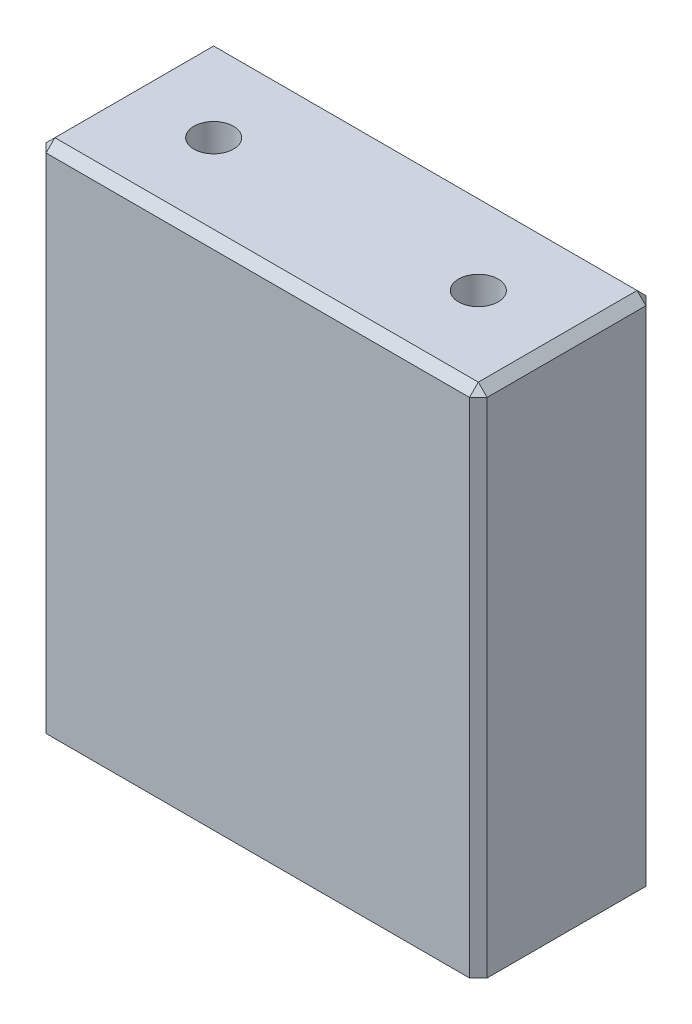
ISO-10303-21;
HEADER;
FILE_DESCRIPTION(('STEP AP214'),'2;1');
FILE_NAME('part.step','',(''),(''),'','','');
FILE_SCHEMA(('AUTOMOTIVE_DESIGN { 1 0 10303 214 1 1 1 1 }'));
ENDSEC;
DATA;
#1=APPLICATION_CONTEXT('core data for automotive mechanical design processes');
#2=APPLICATION_PROTOCOL_DEFINITION('international standard','automotive_design',2000,#1);
#3=PRODUCT_CONTEXT('',#1,'mechanical');
#4=PRODUCT('Part','Part','',(#3));
#5=PRODUCT_RELATED_PRODUCT_CATEGORY('part','',(#4));
#6=PRODUCT_DEFINITION_FORMATION('','',#4);
#7=PRODUCT_DEFINITION_CONTEXT('part definition',#1,'design');
#8=PRODUCT_DEFINITION('design','',#6,#7);
#9=PRODUCT_DEFINITION_SHAPE('','',#8);
#10=(LENGTH_UNIT() NAMED_UNIT(*) SI_UNIT(.MILLI.,.METRE.));
#11=(NAMED_UNIT(*) PLANE_ANGLE_UNIT() SI_UNIT($,.RADIAN.));
#12=(NAMED_UNIT(*) SI_UNIT($,.STERADIAN.) SOLID_ANGLE_UNIT());
#13=UNCERTAINTY_MEASURE_WITH_UNIT(LENGTH_MEASURE(1.E-05),#10,'distance_accuracy_value','');
#14=(GEOMETRIC_REPRESENTATION_CONTEXT(3) GLOBAL_UNCERTAINTY_ASSIGNED_CONTEXT((#13)) GLOBAL_UNIT_ASSIGNED_CONTEXT((#10,
#11,#12)) REPRESENTATION_CONTEXT('',''));
#15=CARTESIAN_POINT('',(0.,0.,0.));
#16=DIRECTION('',(0.,0.,1.));
#17=DIRECTION('',(1.,0.,0.));
#18=AXIS2_PLACEMENT_3D('',#15,#16,#17);
#19=CARTESIAN_POINT('',(50.,0.,10.));
#20=DIRECTION('',(0.,1.,0.));
#21=DIRECTION('',(-1.,0.,0.));
#22=AXIS2_PLACEMENT_3D('',#19,#20,#21);
#23=CYLINDRICAL_SURFACE('',#22,2.25);
#24=CARTESIAN_POINT('',(50.,58.,10.));
#25=DIRECTION('',(0.,1.,0.));
#26=DIRECTION('',(-1.,0.,0.));
#27=AXIS2_PLACEMENT_3D('',#24,#25,#26);
#28=CIRCLE('',#27,2.25);
#29=CARTESIAN_POINT('',(47.75,58.,10.));
#30=VERTEX_POINT('',#29);
#31=EDGE_CURVE('E201',#30,#30,#28,.T.);
#32=ORIENTED_EDGE('',*,*,#31,.T.);
#33=EDGE_LOOP('',(#32));
#34=FACE_BOUND('',#33,.T.);
#35=CARTESIAN_POINT('',(50.,53.,10.));
#36=DIRECTION('',(0.,-1.,0.));
#37=DIRECTION('',(1.,0.,0.));
#38=AXIS2_PLACEMENT_3D('',#35,#36,#37);
#39=CIRCLE('',#38,2.25);
#40=CARTESIAN_POINT('',(52.25,53.,10.));
#41=VERTEX_POINT('',#40);
#42=EDGE_CURVE('E198',#41,#41,#39,.F.);
#43=ORIENTED_EDGE('',*,*,#42,.F.);
#44=EDGE_LOOP('',(#43));
#45=FACE_BOUND('',#44,.T.);
#46=ADVANCED_FACE('F47',(#34,#45),#23,.F.);
#47=CARTESIAN_POINT('',(20.,0.,10.));
#48=DIRECTION('',(0.,1.,0.));
#49=DIRECTION('',(-1.,0.,0.));
#50=AXIS2_PLACEMENT_3D('',#47,#48,#49);
#51=CYLINDRICAL_SURFACE('',#50,2.25);
#52=CARTESIAN_POINT('',(20.,58.,10.));
#53=DIRECTION('',(0.,1.,0.));
#54=DIRECTION('',(-1.,0.,0.));
#55=AXIS2_PLACEMENT_3D('',#52,#53,#54);
#56=CIRCLE('',#55,2.25);
#57=CARTESIAN_POINT('',(17.75,58.,10.));
#58=VERTEX_POINT('',#57);
#59=EDGE_CURVE('E202',#58,#58,#56,.T.);
#60=ORIENTED_EDGE('',*,*,#59,.T.);
#61=EDGE_LOOP('',(#60));
#62=FACE_BOUND('',#61,.T.);
#63=CARTESIAN_POINT('',(20.,53.,10.));
#64=DIRECTION('',(0.,-1.,0.));
#65=DIRECTION('',(1.,0.,0.));
#66=AXIS2_PLACEMENT_3D('',#63,#64,#65);
#67=CIRCLE('',#66,2.25);
#68=CARTESIAN_POINT('',(22.25,53.,10.));
#69=VERTEX_POINT('',#68);
#70=EDGE_CURVE('E196',#69,#69,#67,.F.);
#71=ORIENTED_EDGE('',*,*,#70,.F.);
#72=EDGE_LOOP('',(#71));
#73=FACE_BOUND('',#72,.T.);
#74=ADVANCED_FACE('F361',(#62,#73),#51,.F.);
#75=CARTESIAN_POINT('',(60.,58.,20.));
#76=DIRECTION('',(0.,-1.,0.));
#77=DIRECTION('',(1.,0.,0.));
#78=AXIS2_PLACEMENT_3D('',#75,#76,#77);
#79=PLANE('',#78);
#80=DIRECTION('',(-1.,0.,0.));
#81=VECTOR('',#80,1.);
#82=CARTESIAN_POINT('',(60.,58.,1.00000000000001));
#83=LINE('',#82,#81);
#84=CARTESIAN_POINT('',(59.,58.,1.00000000000001));
#85=VERTEX_POINT('',#84);
#86=CARTESIAN_POINT('',(11.,58.,1.00000000000001));
#87=VERTEX_POINT('',#86);
#88=EDGE_CURVE('E58',#85,#87,#83,.T.);
#89=ORIENTED_EDGE('',*,*,#88,.T.);
#90=DIRECTION('',(0.,0.,1.));
#91=VECTOR('',#90,1.);
#92=CARTESIAN_POINT('',(11.,58.,20.));
#93=LINE('',#92,#91);
#94=CARTESIAN_POINT('',(11.,58.,19.));
#95=VERTEX_POINT('',#94);
#96=EDGE_CURVE('E12',#87,#95,#93,.T.);
#97=ORIENTED_EDGE('',*,*,#96,.T.);
#98=DIRECTION('',(1.,0.,0.));
#99=VECTOR('',#98,1.);
#100=CARTESIAN_POINT('',(60.,58.,19.));
#101=LINE('',#100,#99);
#102=CARTESIAN_POINT('',(59.,58.,19.));
#103=VERTEX_POINT('',#102);
#104=EDGE_CURVE('E276',#95,#103,#101,.T.);
#105=ORIENTED_EDGE('',*,*,#104,.T.);
#106=DIRECTION('',(0.,0.,-1.));
#107=VECTOR('',#106,1.);
#108=CARTESIAN_POINT('',(59.,58.,20.));
#109=LINE('',#108,#107);
#110=EDGE_CURVE('E69',#103,#85,#109,.T.);
#111=ORIENTED_EDGE('',*,*,#110,.T.);
#112=EDGE_LOOP('',(#89,#97,#105,#111));
#113=FACE_BOUND('',#112,.T.);
#114=ORIENTED_EDGE('',*,*,#59,.F.);
#115=EDGE_LOOP('',(#114));
#116=FACE_BOUND('',#115,.T.);
#117=ORIENTED_EDGE('',*,*,#31,.F.);
#118=EDGE_LOOP('',(#117));
#119=FACE_BOUND('',#118,.T.);
#120=ADVANCED_FACE('F366',(#113,#116,#119),#79,.F.);
#121=CARTESIAN_POINT('',(10.,58.,20.));
#122=DIRECTION('',(1.,0.,0.));
#123=DIRECTION('',(0.,0.,-1.));
#124=AXIS2_PLACEMENT_3D('',#121,#122,#123);
#125=PLANE('',#124);
#126=DIRECTION('',(0.,0.,-1.));
#127=VECTOR('',#126,1.);
#128=CARTESIAN_POINT('',(10.,57.,20.));
#129=LINE('',#128,#127);
#130=CARTESIAN_POINT('',(10.,57.,19.));
#131=VERTEX_POINT('',#130);
#132=CARTESIAN_POINT('',(10.,57.,1.));
#133=VERTEX_POINT('',#132);
#134=EDGE_CURVE('E267',#131,#133,#129,.T.);
#135=ORIENTED_EDGE('',*,*,#134,.T.);
#136=DIRECTION('',(0.,-1.,0.));
#137=VECTOR('',#136,1.);
#138=CARTESIAN_POINT('',(10.,58.,1.));
#139=LINE('',#138,#137);
#140=CARTESIAN_POINT('',(10.,0.,1.));
#141=VERTEX_POINT('',#140);
#142=EDGE_CURVE('E273',#133,#141,#139,.T.);
#143=ORIENTED_EDGE('',*,*,#142,.T.);
#144=DIRECTION('',(0.,0.,-1.));
#145=VECTOR('',#144,1.);
#146=CARTESIAN_POINT('',(10.,0.,20.));
#147=LINE('',#146,#145);
#148=CARTESIAN_POINT('',(10.,0.,19.));
#149=VERTEX_POINT('',#148);
#150=EDGE_CURVE('E221',#149,#141,#147,.T.);
#151=ORIENTED_EDGE('',*,*,#150,.F.);
#152=DIRECTION('',(0.,1.,0.));
#153=VECTOR('',#152,1.);
#154=CARTESIAN_POINT('',(10.,58.,19.));
#155=LINE('',#154,#153);
#156=EDGE_CURVE('E270',#149,#131,#155,.T.);
#157=ORIENTED_EDGE('',*,*,#156,.T.);
#158=EDGE_LOOP('',(#135,#143,#151,#157));
#159=FACE_BOUND('',#158,.T.);
#160=ADVANCED_FACE('F383',(#159),#125,.F.);
#161=CARTESIAN_POINT('',(10.,0.,20.));
#162=DIRECTION('',(0.,1.,0.));
#163=DIRECTION('',(0.,0.,1.));
#164=AXIS2_PLACEMENT_3D('',#161,#162,#163);
#165=PLANE('',#164);
#166=DIRECTION('',(-1.,0.,0.));
#167=VECTOR('',#166,1.);
#168=CARTESIAN_POINT('',(13.,0.,17.));
#169=LINE('',#168,#167);
#170=CARTESIAN_POINT('',(57.,0.,17.));
#171=VERTEX_POINT('',#170);
#172=CARTESIAN_POINT('',(13.,0.,17.));
#173=VERTEX_POINT('',#172);
#174=EDGE_CURVE('E166',#171,#173,#169,.T.);
#175=ORIENTED_EDGE('',*,*,#174,.F.);
#176=DIRECTION('',(0.,0.,1.));
#177=VECTOR('',#176,1.);
#178=CARTESIAN_POINT('',(57.,0.,3.));
#179=LINE('',#178,#177);
#180=CARTESIAN_POINT('',(57.,0.,3.));
#181=VERTEX_POINT('',#180);
#182=EDGE_CURVE('E172',#181,#171,#179,.T.);
#183=ORIENTED_EDGE('',*,*,#182,.F.);
#184=DIRECTION('',(1.,0.,0.));
#185=VECTOR('',#184,1.);
#186=CARTESIAN_POINT('',(13.,0.,3.));
#187=LINE('',#186,#185);
#188=CARTESIAN_POINT('',(13.,0.,3.));
#189=VERTEX_POINT('',#188);
#190=EDGE_CURVE('E177',#189,#181,#187,.T.);
#191=ORIENTED_EDGE('',*,*,#190,.F.);
#192=DIRECTION('',(0.,0.,-1.));
#193=VECTOR('',#192,1.);
#194=CARTESIAN_POINT('',(13.,0.,3.));
#195=LINE('',#194,#193);
#196=EDGE_CURVE('E154',#173,#189,#195,.T.);
#197=ORIENTED_EDGE('',*,*,#196,.F.);
#198=EDGE_LOOP('',(#175,#183,#191,#197));
#199=FACE_BOUND('',#198,.T.);
#200=DIRECTION('',(0.,0.,-1.));
#201=VECTOR('',#200,1.);
#202=CARTESIAN_POINT('',(60.,0.,20.));
#203=LINE('',#202,#201);
#204=CARTESIAN_POINT('',(60.,0.,19.));
#205=VERTEX_POINT('',#204);
#206=CARTESIAN_POINT('',(60.,0.,1.));
#207=VERTEX_POINT('',#206);
#208=EDGE_CURVE('E214',#205,#207,#203,.T.);
#209=ORIENTED_EDGE('',*,*,#208,.F.);
#210=DIRECTION('',(-0.707106781186545,0.,0.70710678118655));
#211=VECTOR('',#210,1.);
#212=CARTESIAN_POINT('',(59.,0.,20.));
#213=LINE('',#212,#211);
#214=CARTESIAN_POINT('',(59.,0.,20.));
#215=VERTEX_POINT('',#214);
#216=EDGE_CURVE('E255',#205,#215,#213,.T.);
#217=ORIENTED_EDGE('',*,*,#216,.T.);
#218=DIRECTION('',(1.,0.,0.));
#219=VECTOR('',#218,1.);
#220=CARTESIAN_POINT('',(10.,0.,20.));
#221=LINE('',#220,#219);
#222=CARTESIAN_POINT('',(11.,0.,20.));
#223=VERTEX_POINT('',#222);
#224=EDGE_CURVE('E210',#223,#215,#221,.T.);
#225=ORIENTED_EDGE('',*,*,#224,.F.);
#226=DIRECTION('',(-0.707106781186545,0.,-0.70710678118655));
#227=VECTOR('',#226,1.);
#228=CARTESIAN_POINT('',(11.,0.,20.));
#229=LINE('',#228,#227);
#230=EDGE_CURVE('E246',#223,#149,#229,.T.);
#231=ORIENTED_EDGE('',*,*,#230,.T.);
#232=ORIENTED_EDGE('',*,*,#150,.T.);
#233=DIRECTION('',(-0.70710678118655,0.,0.707106781186545));
#234=VECTOR('',#233,1.);
#235=CARTESIAN_POINT('',(10.,0.,1.));
#236=LINE('',#235,#234);
#237=CARTESIAN_POINT('',(11.,0.,0.));
#238=VERTEX_POINT('',#237);
#239=EDGE_CURVE('E249',#141,#238,#236,.F.);
#240=ORIENTED_EDGE('',*,*,#239,.T.);
#241=DIRECTION('',(1.,0.,0.));
#242=VECTOR('',#241,1.);
#243=CARTESIAN_POINT('',(10.,0.,0.));
#244=LINE('',#243,#242);
#245=CARTESIAN_POINT('',(59.,0.,0.));
#246=VERTEX_POINT('',#245);
#247=EDGE_CURVE('E206',#238,#246,#244,.T.);
#248=ORIENTED_EDGE('',*,*,#247,.T.);
#249=DIRECTION('',(-0.70710678118655,0.,-0.707106781186545));
#250=VECTOR('',#249,1.);
#251=CARTESIAN_POINT('',(60.,0.,1.));
#252=LINE('',#251,#250);
#253=EDGE_CURVE('E252',#246,#207,#252,.F.);
#254=ORIENTED_EDGE('',*,*,#253,.T.);
#255=EDGE_LOOP('',(#209,#217,#225,#231,#232,#240,#248,#254));
#256=FACE_BOUND('',#255,.T.);
#257=ADVANCED_FACE('F174',(#199,#256),#165,.F.);
#258=CARTESIAN_POINT('',(60.,0.,20.));
#259=DIRECTION('',(-1.,0.,0.));
#260=DIRECTION('',(0.,0.,1.));
#261=AXIS2_PLACEMENT_3D('',#258,#259,#260);
#262=PLANE('',#261);
#263=DIRECTION('',(0.,0.,1.));
#264=VECTOR('',#263,1.);
#265=CARTESIAN_POINT('',(60.,57.,20.));
#266=LINE('',#265,#264);
#267=CARTESIAN_POINT('',(60.,57.,1.));
#268=VERTEX_POINT('',#267);
#269=CARTESIAN_POINT('',(60.,57.,19.));
#270=VERTEX_POINT('',#269);
#271=EDGE_CURVE('E237',#268,#270,#266,.T.);
#272=ORIENTED_EDGE('',*,*,#271,.T.);
#273=DIRECTION('',(0.,-1.,0.));
#274=VECTOR('',#273,1.);
#275=CARTESIAN_POINT('',(60.,0.,19.));
#276=LINE('',#275,#274);
#277=EDGE_CURVE('E243',#270,#205,#276,.T.);
#278=ORIENTED_EDGE('',*,*,#277,.T.);
#279=ORIENTED_EDGE('',*,*,#208,.T.);
#280=DIRECTION('',(0.,1.,0.));
#281=VECTOR('',#280,1.);
#282=CARTESIAN_POINT('',(60.,0.,1.));
#283=LINE('',#282,#281);
#284=EDGE_CURVE('E240',#207,#268,#283,.T.);
#285=ORIENTED_EDGE('',*,*,#284,.T.);
#286=EDGE_LOOP('',(#272,#278,#279,#285));
#287=FACE_BOUND('',#286,.T.);
#288=ADVANCED_FACE('F373',(#287),#262,.F.);
#289=CARTESIAN_POINT('',(0.,0.,20.));
#290=DIRECTION('',(0.,0.,1.));
#291=DIRECTION('',(1.,0.,0.));
#292=AXIS2_PLACEMENT_3D('',#289,#290,#291);
#293=PLANE('',#292);
#294=ORIENTED_EDGE('',*,*,#224,.T.);
#295=DIRECTION('',(0.,1.,0.));
#296=VECTOR('',#295,1.);
#297=CARTESIAN_POINT('',(59.,58.,20.));
#298=LINE('',#297,#296);
#299=CARTESIAN_POINT('',(59.,57.,20.));
#300=VERTEX_POINT('',#299);
#301=EDGE_CURVE('E234',#215,#300,#298,.T.);
#302=ORIENTED_EDGE('',*,*,#301,.T.);
#303=DIRECTION('',(-1.,0.,0.));
#304=VECTOR('',#303,1.);
#305=CARTESIAN_POINT('',(10.,57.,20.));
#306=LINE('',#305,#304);
#307=CARTESIAN_POINT('',(11.,57.,20.));
#308=VERTEX_POINT('',#307);
#309=EDGE_CURVE('E225',#300,#308,#306,.T.);
#310=ORIENTED_EDGE('',*,*,#309,.T.);
#311=DIRECTION('',(0.,-1.,0.));
#312=VECTOR('',#311,1.);
#313=CARTESIAN_POINT('',(11.,0.,20.));
#314=LINE('',#313,#312);
#315=EDGE_CURVE('E231',#308,#223,#314,.T.);
#316=ORIENTED_EDGE('',*,*,#315,.T.);
#317=EDGE_LOOP('',(#294,#302,#310,#316));
#318=FACE_BOUND('',#317,.T.);
#319=ADVANCED_FACE('F370',(#318),#293,.T.);
#320=CARTESIAN_POINT('',(0.,0.,0.));
#321=DIRECTION('',(0.,0.,1.));
#322=DIRECTION('',(1.,0.,0.));
#323=AXIS2_PLACEMENT_3D('',#320,#321,#322);
#324=PLANE('',#323);
#325=DIRECTION('',(1.,0.,0.));
#326=VECTOR('',#325,1.);
#327=CARTESIAN_POINT('',(0.,57.,0.));
#328=LINE('',#327,#326);
#329=CARTESIAN_POINT('',(11.,57.,0.));
#330=VERTEX_POINT('',#329);
#331=CARTESIAN_POINT('',(59.,57.,0.));
#332=VERTEX_POINT('',#331);
#333=EDGE_CURVE('E258',#330,#332,#328,.T.);
#334=ORIENTED_EDGE('',*,*,#333,.T.);
#335=DIRECTION('',(0.,-1.,0.));
#336=VECTOR('',#335,1.);
#337=CARTESIAN_POINT('',(59.,0.,0.));
#338=LINE('',#337,#336);
#339=EDGE_CURVE('E264',#332,#246,#338,.T.);
#340=ORIENTED_EDGE('',*,*,#339,.T.);
#341=ORIENTED_EDGE('',*,*,#247,.F.);
#342=DIRECTION('',(0.,1.,0.));
#343=VECTOR('',#342,1.);
#344=CARTESIAN_POINT('',(11.,0.,0.));
#345=LINE('',#344,#343);
#346=EDGE_CURVE('E261',#238,#330,#345,.T.);
#347=ORIENTED_EDGE('',*,*,#346,.T.);
#348=EDGE_LOOP('',(#334,#340,#341,#347));
#349=FACE_BOUND('',#348,.T.);
#350=ADVANCED_FACE('F356',(#349),#324,.F.);
#351=CARTESIAN_POINT('',(60.,53.,20.));
#352=DIRECTION('',(0.,-1.,0.));
#353=DIRECTION('',(1.,0.,0.));
#354=AXIS2_PLACEMENT_3D('',#351,#352,#353);
#355=PLANE('',#354);
#356=DIRECTION('',(0.,0.,-1.));
#357=VECTOR('',#356,1.);
#358=CARTESIAN_POINT('',(57.,53.,3.));
#359=LINE('',#358,#357);
#360=CARTESIAN_POINT('',(57.,53.,17.));
#361=VERTEX_POINT('',#360);
#362=CARTESIAN_POINT('',(57.,53.,3.));
#363=VERTEX_POINT('',#362);
#364=EDGE_CURVE('E197',#361,#363,#359,.T.);
#365=ORIENTED_EDGE('',*,*,#364,.F.);
#366=DIRECTION('',(1.,0.,0.));
#367=VECTOR('',#366,1.);
#368=CARTESIAN_POINT('',(13.,53.,17.));
#369=LINE('',#368,#367);
#370=CARTESIAN_POINT('',(13.,53.,17.));
#371=VERTEX_POINT('',#370);
#372=EDGE_CURVE('E193',#371,#361,#369,.T.);
#373=ORIENTED_EDGE('',*,*,#372,.F.);
#374=DIRECTION('',(0.,0.,1.));
#375=VECTOR('',#374,1.);
#376=CARTESIAN_POINT('',(13.,53.,3.));
#377=LINE('',#376,#375);
#378=CARTESIAN_POINT('',(13.,53.,3.));
#379=VERTEX_POINT('',#378);
#380=EDGE_CURVE('E157',#379,#371,#377,.T.);
#381=ORIENTED_EDGE('',*,*,#380,.F.);
#382=DIRECTION('',(-1.,0.,0.));
#383=VECTOR('',#382,1.);
#384=CARTESIAN_POINT('',(13.,53.,3.));
#385=LINE('',#384,#383);
#386=EDGE_CURVE('E337',#363,#379,#385,.T.);
#387=ORIENTED_EDGE('',*,*,#386,.F.);
#388=EDGE_LOOP('',(#365,#373,#381,#387));
#389=FACE_BOUND('',#388,.T.);
#390=ORIENTED_EDGE('',*,*,#70,.T.);
#391=EDGE_LOOP('',(#390));
#392=FACE_BOUND('',#391,.T.);
#393=ORIENTED_EDGE('',*,*,#42,.T.);
#394=EDGE_LOOP('',(#393));
#395=FACE_BOUND('',#394,.T.);
#396=ADVANCED_FACE('F347',(#389,#392,#395),#355,.T.);
#397=CARTESIAN_POINT('',(57.,104.173585522461,3.));
#398=DIRECTION('',(1.,0.,0.));
#399=DIRECTION('',(0.,0.,-1.));
#400=AXIS2_PLACEMENT_3D('',#397,#398,#399);
#401=PLANE('',#400);
#402=ORIENTED_EDGE('',*,*,#364,.T.);
#403=DIRECTION('',(0.,-1.,0.));
#404=VECTOR('',#403,1.);
#405=CARTESIAN_POINT('',(57.,104.173585522461,3.));
#406=LINE('',#405,#404);
#407=EDGE_CURVE('E186',#363,#181,#406,.T.);
#408=ORIENTED_EDGE('',*,*,#407,.T.);
#409=ORIENTED_EDGE('',*,*,#182,.T.);
#410=DIRECTION('',(0.,-1.,0.));
#411=VECTOR('',#410,1.);
#412=CARTESIAN_POINT('',(57.,104.173585522461,17.));
#413=LINE('',#412,#411);
#414=EDGE_CURVE('E162',#361,#171,#413,.T.);
#415=ORIENTED_EDGE('',*,*,#414,.F.);
#416=EDGE_LOOP('',(#402,#408,#409,#415));
#417=FACE_BOUND('',#416,.T.);
#418=ADVANCED_FACE('F349',(#417),#401,.F.);
#419=CARTESIAN_POINT('',(13.,104.173585522461,3.));
#420=DIRECTION('',(0.,0.,-1.));
#421=DIRECTION('',(-1.,0.,0.));
#422=AXIS2_PLACEMENT_3D('',#419,#420,#421);
#423=PLANE('',#422);
#424=ORIENTED_EDGE('',*,*,#386,.T.);
#425=DIRECTION('',(0.,-1.,0.));
#426=VECTOR('',#425,1.);
#427=CARTESIAN_POINT('',(13.,104.173585522461,3.));
#428=LINE('',#427,#426);
#429=EDGE_CURVE('E161',#379,#189,#428,.T.);
#430=ORIENTED_EDGE('',*,*,#429,.T.);
#431=ORIENTED_EDGE('',*,*,#190,.T.);
#432=ORIENTED_EDGE('',*,*,#407,.F.);
#433=EDGE_LOOP('',(#424,#430,#431,#432));
#434=FACE_BOUND('',#433,.T.);
#435=ADVANCED_FACE('F344',(#434),#423,.F.);
#436=CARTESIAN_POINT('',(13.,104.173585522461,3.));
#437=DIRECTION('',(-1.,0.,0.));
#438=DIRECTION('',(0.,0.,1.));
#439=AXIS2_PLACEMENT_3D('',#436,#437,#438);
#440=PLANE('',#439);
#441=ORIENTED_EDGE('',*,*,#380,.T.);
#442=DIRECTION('',(0.,-1.,0.));
#443=VECTOR('',#442,1.);
#444=CARTESIAN_POINT('',(13.,104.173585522461,17.));
#445=LINE('',#444,#443);
#446=EDGE_CURVE('E149',#371,#173,#445,.T.);
#447=ORIENTED_EDGE('',*,*,#446,.T.);
#448=ORIENTED_EDGE('',*,*,#196,.T.);
#449=ORIENTED_EDGE('',*,*,#429,.F.);
#450=EDGE_LOOP('',(#441,#447,#448,#449));
#451=FACE_BOUND('',#450,.T.);
#452=ADVANCED_FACE('F151',(#451),#440,.F.);
#453=CARTESIAN_POINT('',(13.,104.173585522461,17.));
#454=DIRECTION('',(0.,0.,1.));
#455=DIRECTION('',(1.,0.,0.));
#456=AXIS2_PLACEMENT_3D('',#453,#454,#455);
#457=PLANE('',#456);
#458=ORIENTED_EDGE('',*,*,#372,.T.);
#459=ORIENTED_EDGE('',*,*,#414,.T.);
#460=ORIENTED_EDGE('',*,*,#174,.T.);
#461=ORIENTED_EDGE('',*,*,#446,.F.);
#462=EDGE_LOOP('',(#458,#459,#460,#461));
#463=FACE_BOUND('',#462,.T.);
#464=ADVANCED_FACE('F167',(#463),#457,.F.);
#465=CARTESIAN_POINT('',(10.,58.,1.));
#466=DIRECTION('',(0.707106781186545,0.,0.70710678118655));
#467=DIRECTION('',(0.,-1.,0.));
#468=AXIS2_PLACEMENT_3D('',#465,#466,#467);
#469=PLANE('',#468);
#470=DIRECTION('',(0.70710678118655,0.,-0.707106781186545));
#471=VECTOR('',#470,1.);
#472=CARTESIAN_POINT('',(11.,57.,0.));
#473=LINE('',#472,#471);
#474=EDGE_CURVE('E52',#330,#133,#473,.F.);
#475=ORIENTED_EDGE('',*,*,#474,.F.);
#476=ORIENTED_EDGE('',*,*,#346,.F.);
#477=ORIENTED_EDGE('',*,*,#239,.F.);
#478=ORIENTED_EDGE('',*,*,#142,.F.);
#479=EDGE_LOOP('',(#475,#476,#477,#478));
#480=FACE_BOUND('',#479,.T.);
#481=ADVANCED_FACE('F50',(#480),#469,.F.);
#482=CARTESIAN_POINT('',(11.,57.,0.));
#483=DIRECTION('',(-0.57735026918962,0.577350269189629,-0.577350269189629));
#484=DIRECTION('',(0.,0.707106781186547,0.707106781186547));
#485=AXIS2_PLACEMENT_3D('',#482,#483,#484);
#486=PLANE('',#485);
#487=DIRECTION('',(0.,0.707106781186547,0.707106781186548));
#488=VECTOR('',#487,1.);
#489=CARTESIAN_POINT('',(11.,57.,0.));
#490=LINE('',#489,#488);
#491=EDGE_CURVE('E318',#330,#87,#490,.T.);
#492=ORIENTED_EDGE('',*,*,#491,.F.);
#493=ORIENTED_EDGE('',*,*,#474,.T.);
#494=DIRECTION('',(-0.70710678118655,-0.707106781186545,0.));
#495=VECTOR('',#494,1.);
#496=CARTESIAN_POINT('',(10.5,57.5,1.));
#497=LINE('',#496,#495);
#498=EDGE_CURVE('E320',#87,#133,#497,.T.);
#499=ORIENTED_EDGE('',*,*,#498,.F.);
#500=EDGE_LOOP('',(#492,#493,#499));
#501=FACE_BOUND('',#500,.T.);
#502=ADVANCED_FACE('F457',(#501),#486,.T.);
#503=CARTESIAN_POINT('',(11.,0.,20.));
#504=DIRECTION('',(-0.70710678118655,0.,0.707106781186545));
#505=DIRECTION('',(0.,1.,0.));
#506=AXIS2_PLACEMENT_3D('',#503,#504,#505);
#507=PLANE('',#506);
#508=ORIENTED_EDGE('',*,*,#230,.F.);
#509=ORIENTED_EDGE('',*,*,#315,.F.);
#510=DIRECTION('',(0.707106781186545,0.,0.70710678118655));
#511=VECTOR('',#510,1.);
#512=CARTESIAN_POINT('',(10.,57.,19.));
#513=LINE('',#512,#511);
#514=EDGE_CURVE('E314',#131,#308,#513,.T.);
#515=ORIENTED_EDGE('',*,*,#514,.F.);
#516=ORIENTED_EDGE('',*,*,#156,.F.);
#517=EDGE_LOOP('',(#508,#509,#515,#516));
#518=FACE_BOUND('',#517,.T.);
#519=ADVANCED_FACE('F452',(#518),#507,.T.);
#520=CARTESIAN_POINT('',(10.,57.,20.));
#521=DIRECTION('',(0.707106781186545,-0.70710678118655,0.));
#522=DIRECTION('',(0.,0.,-1.));
#523=AXIS2_PLACEMENT_3D('',#520,#521,#522);
#524=PLANE('',#523);
#525=ORIENTED_EDGE('',*,*,#498,.T.);
#526=ORIENTED_EDGE('',*,*,#134,.F.);
#527=DIRECTION('',(0.70710678118655,0.707106781186545,0.));
#528=VECTOR('',#527,1.);
#529=CARTESIAN_POINT('',(10.,57.,19.));
#530=LINE('',#529,#528);
#531=EDGE_CURVE('E310',#95,#131,#530,.F.);
#532=ORIENTED_EDGE('',*,*,#531,.F.);
#533=ORIENTED_EDGE('',*,*,#96,.F.);
#534=EDGE_LOOP('',(#525,#526,#532,#533));
#535=FACE_BOUND('',#534,.T.);
#536=ADVANCED_FACE('F445',(#535),#524,.F.);
#537=CARTESIAN_POINT('',(60.,58.,1.00000000000001));
#538=DIRECTION('',(0.,-0.707106781186548,0.707106781186547));
#539=DIRECTION('',(-1.,0.,0.));
#540=AXIS2_PLACEMENT_3D('',#537,#538,#539);
#541=PLANE('',#540);
#542=ORIENTED_EDGE('',*,*,#491,.T.);
#543=ORIENTED_EDGE('',*,*,#88,.F.);
#544=DIRECTION('',(0.,-0.707106781186547,-0.707106781186548));
#545=VECTOR('',#544,1.);
#546=CARTESIAN_POINT('',(59.,57.5,0.500000000000005));
#547=LINE('',#546,#545);
#548=EDGE_CURVE('E306',#332,#85,#547,.F.);
#549=ORIENTED_EDGE('',*,*,#548,.F.);
#550=ORIENTED_EDGE('',*,*,#333,.F.);
#551=EDGE_LOOP('',(#542,#543,#549,#550));
#552=FACE_BOUND('',#551,.T.);
#553=ADVANCED_FACE('F438',(#552),#541,.F.);
#554=CARTESIAN_POINT('',(60.,0.,1.));
#555=DIRECTION('',(-0.707106781186545,0.,0.70710678118655));
#556=DIRECTION('',(0.,1.,0.));
#557=AXIS2_PLACEMENT_3D('',#554,#555,#556);
#558=PLANE('',#557);
#559=ORIENTED_EDGE('',*,*,#253,.F.);
#560=ORIENTED_EDGE('',*,*,#339,.F.);
#561=DIRECTION('',(0.70710678118655,0.,0.707106781186545));
#562=VECTOR('',#561,1.);
#563=CARTESIAN_POINT('',(60.,57.,1.));
#564=LINE('',#563,#562);
#565=EDGE_CURVE('E302',#268,#332,#564,.F.);
#566=ORIENTED_EDGE('',*,*,#565,.F.);
#567=ORIENTED_EDGE('',*,*,#284,.F.);
#568=EDGE_LOOP('',(#559,#560,#566,#567));
#569=FACE_BOUND('',#568,.T.);
#570=ADVANCED_FACE('F431',(#569),#558,.F.);
#571=CARTESIAN_POINT('',(10.,57.,19.));
#572=DIRECTION('',(-0.577350269189624,0.577350269189628,0.577350269189625));
#573=DIRECTION('',(0.,-0.707106781186545,0.70710678118655));
#574=AXIS2_PLACEMENT_3D('',#571,#572,#573);
#575=PLANE('',#574);
#576=ORIENTED_EDGE('',*,*,#531,.T.);
#577=ORIENTED_EDGE('',*,*,#514,.T.);
#578=DIRECTION('',(0.,0.707106781186547,-0.707106781186548));
#579=VECTOR('',#578,1.);
#580=CARTESIAN_POINT('',(11.,57.5,19.5));
#581=LINE('',#580,#579);
#582=EDGE_CURVE('E298',#95,#308,#581,.F.);
#583=ORIENTED_EDGE('',*,*,#582,.F.);
#584=EDGE_LOOP('',(#576,#577,#583));
#585=FACE_BOUND('',#584,.T.);
#586=ADVANCED_FACE('F424',(#585),#575,.T.);
#587=CARTESIAN_POINT('',(60.,57.,1.));
#588=DIRECTION('',(0.577350269189621,0.577350269189628,-0.577350269189628));
#589=DIRECTION('',(0.,0.707106781186548,0.707106781186548));
#590=AXIS2_PLACEMENT_3D('',#587,#588,#589);
#591=PLANE('',#590);
#592=ORIENTED_EDGE('',*,*,#565,.T.);
#593=ORIENTED_EDGE('',*,*,#548,.T.);
#594=DIRECTION('',(-0.70710678118655,0.707106781186545,0.));
#595=VECTOR('',#594,1.);
#596=CARTESIAN_POINT('',(60.,57.,1.));
#597=LINE('',#596,#595);
#598=EDGE_CURVE('E294',#268,#85,#597,.T.);
#599=ORIENTED_EDGE('',*,*,#598,.F.);
#600=EDGE_LOOP('',(#592,#593,#599));
#601=FACE_BOUND('',#600,.T.);
#602=ADVANCED_FACE('F417',(#601),#591,.T.);
#603=CARTESIAN_POINT('',(0.,57.,20.));
#604=DIRECTION('',(0.,0.707106781186548,0.707106781186547));
#605=DIRECTION('',(1.,0.,0.));
#606=AXIS2_PLACEMENT_3D('',#603,#604,#605);
#607=PLANE('',#606);
#608=ORIENTED_EDGE('',*,*,#582,.T.);
#609=ORIENTED_EDGE('',*,*,#309,.F.);
#610=DIRECTION('',(0.,-0.707106781186547,0.707106781186548));
#611=VECTOR('',#610,1.);
#612=CARTESIAN_POINT('',(59.,57.,20.));
#613=LINE('',#612,#611);
#614=EDGE_CURVE('E290',#103,#300,#613,.T.);
#615=ORIENTED_EDGE('',*,*,#614,.F.);
#616=ORIENTED_EDGE('',*,*,#104,.F.);
#617=EDGE_LOOP('',(#608,#609,#615,#616));
#618=FACE_BOUND('',#617,.T.);
#619=ADVANCED_FACE('F410',(#618),#607,.T.);
#620=CARTESIAN_POINT('',(59.,58.,20.));
#621=DIRECTION('',(-0.707106781186545,-0.70710678118655,0.));
#622=DIRECTION('',(0.,0.,-1.));
#623=AXIS2_PLACEMENT_3D('',#620,#621,#622);
#624=PLANE('',#623);
#625=ORIENTED_EDGE('',*,*,#598,.T.);
#626=ORIENTED_EDGE('',*,*,#110,.F.);
#627=DIRECTION('',(0.70710678118655,-0.707106781186545,0.));
#628=VECTOR('',#627,1.);
#629=CARTESIAN_POINT('',(59.5,57.5,19.));
#630=LINE('',#629,#628);
#631=EDGE_CURVE('E286',#270,#103,#630,.F.);
#632=ORIENTED_EDGE('',*,*,#631,.F.);
#633=ORIENTED_EDGE('',*,*,#271,.F.);
#634=EDGE_LOOP('',(#625,#626,#632,#633));
#635=FACE_BOUND('',#634,.T.);
#636=ADVANCED_FACE('F403',(#635),#624,.F.);
#637=CARTESIAN_POINT('',(59.,57.,20.));
#638=DIRECTION('',(0.577350269189624,0.577350269189628,0.577350269189624));
#639=DIRECTION('',(0.,-0.707106781186545,0.70710678118655));
#640=AXIS2_PLACEMENT_3D('',#637,#638,#639);
#641=PLANE('',#640);
#642=ORIENTED_EDGE('',*,*,#631,.T.);
#643=ORIENTED_EDGE('',*,*,#614,.T.);
#644=DIRECTION('',(0.707106781186545,0.,-0.70710678118655));
#645=VECTOR('',#644,1.);
#646=CARTESIAN_POINT('',(59.,57.,20.));
#647=LINE('',#646,#645);
#648=EDGE_CURVE('E283',#270,#300,#647,.F.);
#649=ORIENTED_EDGE('',*,*,#648,.F.);
#650=EDGE_LOOP('',(#642,#643,#649));
#651=FACE_BOUND('',#650,.T.);
#652=ADVANCED_FACE('F396',(#651),#641,.T.);
#653=CARTESIAN_POINT('',(59.,0.,20.));
#654=DIRECTION('',(0.70710678118655,0.,0.707106781186545));
#655=DIRECTION('',(0.,-1.,0.));
#656=AXIS2_PLACEMENT_3D('',#653,#654,#655);
#657=PLANE('',#656);
#658=ORIENTED_EDGE('',*,*,#216,.F.);
#659=ORIENTED_EDGE('',*,*,#277,.F.);
#660=ORIENTED_EDGE('',*,*,#648,.T.);
#661=ORIENTED_EDGE('',*,*,#301,.F.);
#662=EDGE_LOOP('',(#658,#659,#660,#661));
#663=FACE_BOUND('',#662,.T.);
#664=ADVANCED_FACE('F390',(#663),#657,.T.);
#665=CLOSED_SHELL('',(#46,#74,#120,#160,#257,#288,#319,#350,#396,#418,#435,#452,#464,#481,#502,
#519,#536,#553,#570,#586,#602,#619,#636,#652,#664));
#666=MANIFOLD_SOLID_BREP('B2',#665);
#667=ADVANCED_BREP_SHAPE_REPRESENTATION('',(#18,#666),#14);
#668=SHAPE_DEFINITION_REPRESENTATION(#9,#667);
ENDSEC;
END-ISO-10303-21;
